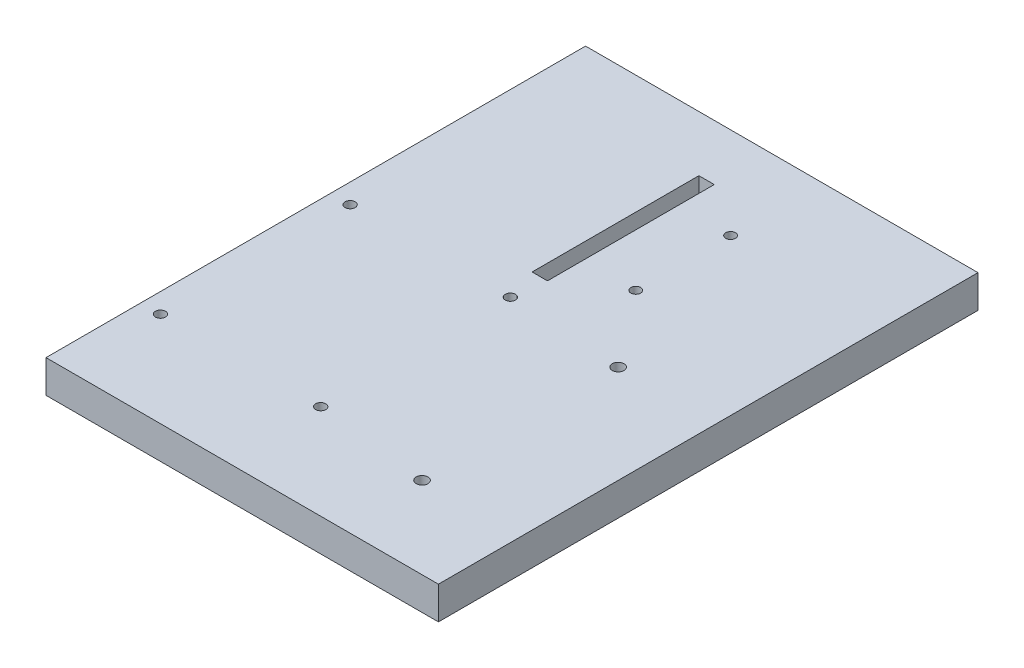
ISO-10303-21;
HEADER;
FILE_DESCRIPTION(('STEP AP214'),'2;1');
FILE_NAME('part.step','',(''),(''),'','','');
FILE_SCHEMA(('AUTOMOTIVE_DESIGN { 1 0 10303 214 1 1 1 1 }'));
ENDSEC;
DATA;
#1=APPLICATION_CONTEXT('core data for automotive mechanical design processes');
#2=APPLICATION_PROTOCOL_DEFINITION('international standard','automotive_design',2000,#1);
#3=PRODUCT_CONTEXT('',#1,'mechanical');
#4=PRODUCT('Part','Part','',(#3));
#5=PRODUCT_RELATED_PRODUCT_CATEGORY('part','',(#4));
#6=PRODUCT_DEFINITION_FORMATION('','',#4);
#7=PRODUCT_DEFINITION_CONTEXT('part definition',#1,'design');
#8=PRODUCT_DEFINITION('design','',#6,#7);
#9=PRODUCT_DEFINITION_SHAPE('','',#8);
#10=(LENGTH_UNIT() NAMED_UNIT(*) SI_UNIT(.MILLI.,.METRE.));
#11=(NAMED_UNIT(*) PLANE_ANGLE_UNIT() SI_UNIT($,.RADIAN.));
#12=(NAMED_UNIT(*) SI_UNIT($,.STERADIAN.) SOLID_ANGLE_UNIT());
#13=UNCERTAINTY_MEASURE_WITH_UNIT(LENGTH_MEASURE(1.E-05),#10,'distance_accuracy_value','');
#14=(GEOMETRIC_REPRESENTATION_CONTEXT(3) GLOBAL_UNCERTAINTY_ASSIGNED_CONTEXT((#13)) GLOBAL_UNIT_ASSIGNED_CONTEXT((#10,
#11,#12)) REPRESENTATION_CONTEXT('',''));
#15=CARTESIAN_POINT('',(0.,0.,0.));
#16=DIRECTION('',(0.,0.,1.));
#17=DIRECTION('',(1.,0.,0.));
#18=AXIS2_PLACEMENT_3D('',#15,#16,#17);
#19=CARTESIAN_POINT('',(0.,10.,0.));
#20=DIRECTION('',(1.,0.,0.));
#21=DIRECTION('',(0.,0.,-1.));
#22=AXIS2_PLACEMENT_3D('',#19,#20,#21);
#23=PLANE('',#22);
#24=DIRECTION('',(0.,0.,1.));
#25=VECTOR('',#24,1.);
#26=CARTESIAN_POINT('',(0.,0.,0.));
#27=LINE('',#26,#25);
#28=CARTESIAN_POINT('',(0.,0.,-165.));
#29=VERTEX_POINT('',#28);
#30=CARTESIAN_POINT('',(0.,0.,0.));
#31=VERTEX_POINT('',#30);
#32=EDGE_CURVE('E224',#29,#31,#27,.T.);
#33=ORIENTED_EDGE('',*,*,#32,.T.);
#34=DIRECTION('',(0.,-1.,0.));
#35=VECTOR('',#34,1.);
#36=CARTESIAN_POINT('',(0.,10.,0.));
#37=LINE('',#36,#35);
#38=CARTESIAN_POINT('',(0.,10.,0.));
#39=VERTEX_POINT('',#38);
#40=EDGE_CURVE('E11',#39,#31,#37,.T.);
#41=ORIENTED_EDGE('',*,*,#40,.F.);
#42=DIRECTION('',(0.,0.,1.));
#43=VECTOR('',#42,1.);
#44=CARTESIAN_POINT('',(0.,10.,0.));
#45=LINE('',#44,#43);
#46=CARTESIAN_POINT('',(0.,10.,-165.));
#47=VERTEX_POINT('',#46);
#48=EDGE_CURVE('E225',#47,#39,#45,.T.);
#49=ORIENTED_EDGE('',*,*,#48,.F.);
#50=DIRECTION('',(0.,-1.,0.));
#51=VECTOR('',#50,1.);
#52=CARTESIAN_POINT('',(0.,10.,-165.));
#53=LINE('',#52,#51);
#54=EDGE_CURVE('E235',#47,#29,#53,.T.);
#55=ORIENTED_EDGE('',*,*,#54,.T.);
#56=EDGE_LOOP('',(#33,#41,#49,#55));
#57=FACE_BOUND('',#56,.T.);
#58=ADVANCED_FACE('F33',(#57),#23,.F.);
#59=CARTESIAN_POINT('',(0.,10.,0.));
#60=DIRECTION('',(0.,0.,-1.));
#61=DIRECTION('',(-1.,0.,0.));
#62=AXIS2_PLACEMENT_3D('',#59,#60,#61);
#63=PLANE('',#62);
#64=DIRECTION('',(1.,0.,0.));
#65=VECTOR('',#64,1.);
#66=CARTESIAN_POINT('',(0.,0.,0.));
#67=LINE('',#66,#65);
#68=CARTESIAN_POINT('',(120.,0.,0.));
#69=VERTEX_POINT('',#68);
#70=EDGE_CURVE('E238',#31,#69,#67,.T.);
#71=ORIENTED_EDGE('',*,*,#70,.T.);
#72=DIRECTION('',(0.,-1.,0.));
#73=VECTOR('',#72,1.);
#74=CARTESIAN_POINT('',(120.,10.,0.));
#75=LINE('',#74,#73);
#76=CARTESIAN_POINT('',(120.,10.,0.));
#77=VERTEX_POINT('',#76);
#78=EDGE_CURVE('E40',#77,#69,#75,.T.);
#79=ORIENTED_EDGE('',*,*,#78,.F.);
#80=DIRECTION('',(1.,0.,0.));
#81=VECTOR('',#80,1.);
#82=CARTESIAN_POINT('',(0.,10.,0.));
#83=LINE('',#82,#81);
#84=EDGE_CURVE('E228',#39,#77,#83,.T.);
#85=ORIENTED_EDGE('',*,*,#84,.F.);
#86=ORIENTED_EDGE('',*,*,#40,.T.);
#87=EDGE_LOOP('',(#71,#79,#85,#86));
#88=FACE_BOUND('',#87,.T.);
#89=ADVANCED_FACE('F267',(#88),#63,.F.);
#90=CARTESIAN_POINT('',(120.,10.,0.));
#91=DIRECTION('',(-1.,0.,0.));
#92=DIRECTION('',(0.,0.,1.));
#93=AXIS2_PLACEMENT_3D('',#90,#91,#92);
#94=PLANE('',#93);
#95=DIRECTION('',(0.,0.,-1.));
#96=VECTOR('',#95,1.);
#97=CARTESIAN_POINT('',(120.,0.,0.));
#98=LINE('',#97,#96);
#99=CARTESIAN_POINT('',(120.,0.,-165.));
#100=VERTEX_POINT('',#99);
#101=EDGE_CURVE('E240',#69,#100,#98,.T.);
#102=ORIENTED_EDGE('',*,*,#101,.T.);
#103=DIRECTION('',(0.,-1.,0.));
#104=VECTOR('',#103,1.);
#105=CARTESIAN_POINT('',(120.,10.,-165.));
#106=LINE('',#105,#104);
#107=CARTESIAN_POINT('',(120.,10.,-165.));
#108=VERTEX_POINT('',#107);
#109=EDGE_CURVE('E245',#108,#100,#106,.T.);
#110=ORIENTED_EDGE('',*,*,#109,.F.);
#111=DIRECTION('',(0.,0.,-1.));
#112=VECTOR('',#111,1.);
#113=CARTESIAN_POINT('',(120.,10.,0.));
#114=LINE('',#113,#112);
#115=EDGE_CURVE('E231',#77,#108,#114,.T.);
#116=ORIENTED_EDGE('',*,*,#115,.F.);
#117=ORIENTED_EDGE('',*,*,#78,.T.);
#118=EDGE_LOOP('',(#102,#110,#116,#117));
#119=FACE_BOUND('',#118,.T.);
#120=ADVANCED_FACE('F252',(#119),#94,.F.);
#121=CARTESIAN_POINT('',(0.,10.,-165.));
#122=DIRECTION('',(0.,0.,1.));
#123=DIRECTION('',(1.,0.,0.));
#124=AXIS2_PLACEMENT_3D('',#121,#122,#123);
#125=PLANE('',#124);
#126=DIRECTION('',(-1.,0.,0.));
#127=VECTOR('',#126,1.);
#128=CARTESIAN_POINT('',(0.,0.,-165.));
#129=LINE('',#128,#127);
#130=EDGE_CURVE('E229',#100,#29,#129,.T.);
#131=ORIENTED_EDGE('',*,*,#130,.T.);
#132=ORIENTED_EDGE('',*,*,#54,.F.);
#133=DIRECTION('',(-1.,0.,0.));
#134=VECTOR('',#133,1.);
#135=CARTESIAN_POINT('',(0.,10.,-165.));
#136=LINE('',#135,#134);
#137=EDGE_CURVE('E233',#108,#47,#136,.T.);
#138=ORIENTED_EDGE('',*,*,#137,.F.);
#139=ORIENTED_EDGE('',*,*,#109,.T.);
#140=EDGE_LOOP('',(#131,#132,#138,#139));
#141=FACE_BOUND('',#140,.T.);
#142=ADVANCED_FACE('F260',(#141),#125,.F.);
#143=CARTESIAN_POINT('',(0.,10.,0.));
#144=DIRECTION('',(0.,-1.,0.));
#145=DIRECTION('',(0.,0.,-1.));
#146=AXIS2_PLACEMENT_3D('',#143,#144,#145);
#147=PLANE('',#146);
#148=CARTESIAN_POINT('',(72.35,10.,-137.));
#149=DIRECTION('',(0.,1.,0.));
#150=DIRECTION('',(0.,0.,1.));
#151=AXIS2_PLACEMENT_3D('',#148,#149,#150);
#152=CIRCLE('',#151,1.5);
#153=CARTESIAN_POINT('',(72.35,10.,-135.5));
#154=VERTEX_POINT('',#153);
#155=EDGE_CURVE('E401',#154,#154,#152,.T.);
#156=ORIENTED_EDGE('',*,*,#155,.F.);
#157=EDGE_LOOP('',(#156));
#158=FACE_BOUND('',#157,.T.);
#159=CARTESIAN_POINT('',(72.35,10.,-108.));
#160=DIRECTION('',(0.,1.,0.));
#161=DIRECTION('',(0.,0.,1.));
#162=AXIS2_PLACEMENT_3D('',#159,#160,#161);
#163=CIRCLE('',#162,1.5);
#164=CARTESIAN_POINT('',(72.35,10.,-106.5));
#165=VERTEX_POINT('',#164);
#166=EDGE_CURVE('E409',#165,#165,#163,.T.);
#167=ORIENTED_EDGE('',*,*,#166,.F.);
#168=EDGE_LOOP('',(#167));
#169=FACE_BOUND('',#168,.T.);
#170=DIRECTION('',(0.,0.,-1.));
#171=VECTOR('',#170,1.);
#172=CARTESIAN_POINT('',(56.35,10.,-148.));
#173=LINE('',#172,#171);
#174=CARTESIAN_POINT('',(56.35,10.,-97.));
#175=VERTEX_POINT('',#174);
#176=CARTESIAN_POINT('',(56.35,10.,-148.));
#177=VERTEX_POINT('',#176);
#178=EDGE_CURVE('E121',#175,#177,#173,.T.);
#179=ORIENTED_EDGE('',*,*,#178,.F.);
#180=DIRECTION('',(1.,0.,0.));
#181=VECTOR('',#180,1.);
#182=CARTESIAN_POINT('',(51.65,10.,-97.));
#183=LINE('',#182,#181);
#184=CARTESIAN_POINT('',(51.65,10.,-97.));
#185=VERTEX_POINT('',#184);
#186=EDGE_CURVE('E114',#185,#175,#183,.T.);
#187=ORIENTED_EDGE('',*,*,#186,.F.);
#188=DIRECTION('',(0.,0.,1.));
#189=VECTOR('',#188,1.);
#190=CARTESIAN_POINT('',(51.65,10.,-148.));
#191=LINE('',#190,#189);
#192=CARTESIAN_POINT('',(51.65,10.,-148.));
#193=VERTEX_POINT('',#192);
#194=EDGE_CURVE('E125',#193,#185,#191,.T.);
#195=ORIENTED_EDGE('',*,*,#194,.F.);
#196=DIRECTION('',(-1.,0.,0.));
#197=VECTOR('',#196,1.);
#198=CARTESIAN_POINT('',(51.65,10.,-148.));
#199=LINE('',#198,#197);
#200=EDGE_CURVE('E47',#177,#193,#199,.T.);
#201=ORIENTED_EDGE('',*,*,#200,.F.);
#202=EDGE_LOOP('',(#179,#187,#195,#201));
#203=FACE_BOUND('',#202,.T.);
#204=CARTESIAN_POINT('',(90.,10.,-25.));
#205=DIRECTION('',(0.,-1.,0.));
#206=DIRECTION('',(0.,0.,-1.));
#207=AXIS2_PLACEMENT_3D('',#204,#205,#206);
#208=CIRCLE('',#207,1.8);
#209=CARTESIAN_POINT('',(90.,10.,-26.8));
#210=VERTEX_POINT('',#209);
#211=EDGE_CURVE('E146',#210,#210,#208,.T.);
#212=ORIENTED_EDGE('',*,*,#211,.T.);
#213=EDGE_LOOP('',(#212));
#214=FACE_BOUND('',#213,.T.);
#215=CARTESIAN_POINT('',(90.,10.,-84.95));
#216=DIRECTION('',(0.,-1.,0.));
#217=DIRECTION('',(0.,0.,-1.));
#218=AXIS2_PLACEMENT_3D('',#215,#216,#217);
#219=CIRCLE('',#218,1.8);
#220=CARTESIAN_POINT('',(90.,10.,-86.75));
#221=VERTEX_POINT('',#220);
#222=EDGE_CURVE('E161',#221,#221,#219,.T.);
#223=ORIENTED_EDGE('',*,*,#222,.T.);
#224=EDGE_LOOP('',(#223));
#225=FACE_BOUND('',#224,.T.);
#226=CARTESIAN_POINT('',(6.,10.,-29.));
#227=DIRECTION('',(0.,-1.,0.));
#228=DIRECTION('',(0.,0.,-1.));
#229=AXIS2_PLACEMENT_3D('',#226,#227,#228);
#230=CIRCLE('',#229,1.55);
#231=CARTESIAN_POINT('',(6.,10.,-30.55));
#232=VERTEX_POINT('',#231);
#233=EDGE_CURVE('E176',#232,#232,#230,.T.);
#234=ORIENTED_EDGE('',*,*,#233,.T.);
#235=EDGE_LOOP('',(#234));
#236=FACE_BOUND('',#235,.T.);
#237=CARTESIAN_POINT('',(55.,10.,-29.));
#238=DIRECTION('',(0.,-1.,0.));
#239=DIRECTION('',(0.,0.,-1.));
#240=AXIS2_PLACEMENT_3D('',#237,#238,#239);
#241=CIRCLE('',#240,1.55);
#242=CARTESIAN_POINT('',(55.,10.,-30.55));
#243=VERTEX_POINT('',#242);
#244=EDGE_CURVE('E191',#243,#243,#241,.T.);
#245=ORIENTED_EDGE('',*,*,#244,.T.);
#246=EDGE_LOOP('',(#245));
#247=FACE_BOUND('',#246,.T.);
#248=CARTESIAN_POINT('',(55.,10.,-87.));
#249=DIRECTION('',(0.,-1.,0.));
#250=DIRECTION('',(0.,0.,-1.));
#251=AXIS2_PLACEMENT_3D('',#248,#249,#250);
#252=CIRCLE('',#251,1.55);
#253=CARTESIAN_POINT('',(55.,10.,-88.55));
#254=VERTEX_POINT('',#253);
#255=EDGE_CURVE('E206',#254,#254,#252,.T.);
#256=ORIENTED_EDGE('',*,*,#255,.T.);
#257=EDGE_LOOP('',(#256));
#258=FACE_BOUND('',#257,.T.);
#259=CARTESIAN_POINT('',(5.99999999999999,10.,-87.));
#260=DIRECTION('',(0.,-1.,0.));
#261=DIRECTION('',(0.,0.,-1.));
#262=AXIS2_PLACEMENT_3D('',#259,#260,#261);
#263=CIRCLE('',#262,1.55);
#264=CARTESIAN_POINT('',(5.99999999999999,10.,-88.55));
#265=VERTEX_POINT('',#264);
#266=EDGE_CURVE('E221',#265,#265,#263,.T.);
#267=ORIENTED_EDGE('',*,*,#266,.T.);
#268=EDGE_LOOP('',(#267));
#269=FACE_BOUND('',#268,.T.);
#270=ORIENTED_EDGE('',*,*,#48,.T.);
#271=ORIENTED_EDGE('',*,*,#84,.T.);
#272=ORIENTED_EDGE('',*,*,#115,.T.);
#273=ORIENTED_EDGE('',*,*,#137,.T.);
#274=EDGE_LOOP('',(#270,#271,#272,#273));
#275=FACE_BOUND('',#274,.T.);
#276=ADVANCED_FACE('F266',(#158,#169,#203,#214,#225,#236,#247,#258,#269,#275),#147,.F.);
#277=CARTESIAN_POINT('',(0.,0.,0.));
#278=DIRECTION('',(0.,-1.,0.));
#279=DIRECTION('',(0.,0.,-1.));
#280=AXIS2_PLACEMENT_3D('',#277,#278,#279);
#281=PLANE('',#280);
#282=CARTESIAN_POINT('',(72.35,0.,-137.));
#283=DIRECTION('',(0.,-1.,0.));
#284=DIRECTION('',(0.,0.,-1.));
#285=AXIS2_PLACEMENT_3D('',#282,#283,#284);
#286=CIRCLE('',#285,1.5);
#287=CARTESIAN_POINT('',(72.35,0.,-138.5));
#288=VERTEX_POINT('',#287);
#289=EDGE_CURVE('E404',#288,#288,#286,.F.);
#290=ORIENTED_EDGE('',*,*,#289,.T.);
#291=EDGE_LOOP('',(#290));
#292=FACE_BOUND('',#291,.T.);
#293=CARTESIAN_POINT('',(72.35,0.,-108.));
#294=DIRECTION('',(0.,-1.,0.));
#295=DIRECTION('',(0.,0.,-1.));
#296=AXIS2_PLACEMENT_3D('',#293,#294,#295);
#297=CIRCLE('',#296,1.5);
#298=CARTESIAN_POINT('',(72.35,0.,-109.5));
#299=VERTEX_POINT('',#298);
#300=EDGE_CURVE('E406',#299,#299,#297,.F.);
#301=ORIENTED_EDGE('',*,*,#300,.T.);
#302=EDGE_LOOP('',(#301));
#303=FACE_BOUND('',#302,.T.);
#304=DIRECTION('',(1.,0.,0.));
#305=VECTOR('',#304,1.);
#306=CARTESIAN_POINT('',(51.65,0.,-97.));
#307=LINE('',#306,#305);
#308=CARTESIAN_POINT('',(51.65,0.,-97.));
#309=VERTEX_POINT('',#308);
#310=CARTESIAN_POINT('',(56.35,0.,-97.));
#311=VERTEX_POINT('',#310);
#312=EDGE_CURVE('E111',#309,#311,#307,.T.);
#313=ORIENTED_EDGE('',*,*,#312,.T.);
#314=DIRECTION('',(0.,0.,-1.));
#315=VECTOR('',#314,1.);
#316=CARTESIAN_POINT('',(56.35,0.,-148.));
#317=LINE('',#316,#315);
#318=CARTESIAN_POINT('',(56.35,0.,-148.));
#319=VERTEX_POINT('',#318);
#320=EDGE_CURVE('E98',#311,#319,#317,.T.);
#321=ORIENTED_EDGE('',*,*,#320,.T.);
#322=DIRECTION('',(-1.,0.,0.));
#323=VECTOR('',#322,1.);
#324=CARTESIAN_POINT('',(51.65,0.,-148.));
#325=LINE('',#324,#323);
#326=CARTESIAN_POINT('',(51.65,0.,-148.));
#327=VERTEX_POINT('',#326);
#328=EDGE_CURVE('E129',#319,#327,#325,.T.);
#329=ORIENTED_EDGE('',*,*,#328,.T.);
#330=DIRECTION('',(0.,0.,1.));
#331=VECTOR('',#330,1.);
#332=CARTESIAN_POINT('',(51.65,0.,-148.));
#333=LINE('',#332,#331);
#334=EDGE_CURVE('E119',#327,#309,#333,.T.);
#335=ORIENTED_EDGE('',*,*,#334,.T.);
#336=EDGE_LOOP('',(#313,#321,#329,#335));
#337=FACE_BOUND('',#336,.T.);
#338=CARTESIAN_POINT('',(90.,0.,-25.));
#339=DIRECTION('',(0.,-1.,0.));
#340=DIRECTION('',(0.,0.,-1.));
#341=AXIS2_PLACEMENT_3D('',#338,#339,#340);
#342=CIRCLE('',#341,3.525);
#343=CARTESIAN_POINT('',(90.,0.,-28.525));
#344=VERTEX_POINT('',#343);
#345=EDGE_CURVE('E134',#344,#344,#342,.T.);
#346=ORIENTED_EDGE('',*,*,#345,.F.);
#347=EDGE_LOOP('',(#346));
#348=FACE_BOUND('',#347,.T.);
#349=CARTESIAN_POINT('',(90.,0.,-84.95));
#350=DIRECTION('',(0.,-1.,0.));
#351=DIRECTION('',(0.,0.,-1.));
#352=AXIS2_PLACEMENT_3D('',#349,#350,#351);
#353=CIRCLE('',#352,3.525);
#354=CARTESIAN_POINT('',(90.,0.,-88.475));
#355=VERTEX_POINT('',#354);
#356=EDGE_CURVE('E149',#355,#355,#353,.T.);
#357=ORIENTED_EDGE('',*,*,#356,.F.);
#358=EDGE_LOOP('',(#357));
#359=FACE_BOUND('',#358,.T.);
#360=CARTESIAN_POINT('',(6.,0.,-29.));
#361=DIRECTION('',(0.,-1.,0.));
#362=DIRECTION('',(0.,0.,-1.));
#363=AXIS2_PLACEMENT_3D('',#360,#361,#362);
#364=CIRCLE('',#363,3.025);
#365=CARTESIAN_POINT('',(6.,0.,-32.025));
#366=VERTEX_POINT('',#365);
#367=EDGE_CURVE('E164',#366,#366,#364,.T.);
#368=ORIENTED_EDGE('',*,*,#367,.F.);
#369=EDGE_LOOP('',(#368));
#370=FACE_BOUND('',#369,.T.);
#371=CARTESIAN_POINT('',(55.,0.,-29.));
#372=DIRECTION('',(0.,-1.,0.));
#373=DIRECTION('',(0.,0.,-1.));
#374=AXIS2_PLACEMENT_3D('',#371,#372,#373);
#375=CIRCLE('',#374,3.025);
#376=CARTESIAN_POINT('',(55.,0.,-32.025));
#377=VERTEX_POINT('',#376);
#378=EDGE_CURVE('E179',#377,#377,#375,.T.);
#379=ORIENTED_EDGE('',*,*,#378,.F.);
#380=EDGE_LOOP('',(#379));
#381=FACE_BOUND('',#380,.T.);
#382=CARTESIAN_POINT('',(55.,0.,-87.));
#383=DIRECTION('',(0.,-1.,0.));
#384=DIRECTION('',(0.,0.,-1.));
#385=AXIS2_PLACEMENT_3D('',#382,#383,#384);
#386=CIRCLE('',#385,3.025);
#387=CARTESIAN_POINT('',(55.,0.,-90.025));
#388=VERTEX_POINT('',#387);
#389=EDGE_CURVE('E194',#388,#388,#386,.T.);
#390=ORIENTED_EDGE('',*,*,#389,.F.);
#391=EDGE_LOOP('',(#390));
#392=FACE_BOUND('',#391,.T.);
#393=CARTESIAN_POINT('',(5.99999999999999,0.,-87.));
#394=DIRECTION('',(0.,-1.,0.));
#395=DIRECTION('',(0.,0.,-1.));
#396=AXIS2_PLACEMENT_3D('',#393,#394,#395);
#397=CIRCLE('',#396,3.025);
#398=CARTESIAN_POINT('',(5.99999999999999,0.,-90.025));
#399=VERTEX_POINT('',#398);
#400=EDGE_CURVE('E209',#399,#399,#397,.T.);
#401=ORIENTED_EDGE('',*,*,#400,.F.);
#402=EDGE_LOOP('',(#401));
#403=FACE_BOUND('',#402,.T.);
#404=ORIENTED_EDGE('',*,*,#32,.F.);
#405=ORIENTED_EDGE('',*,*,#130,.F.);
#406=ORIENTED_EDGE('',*,*,#101,.F.);
#407=ORIENTED_EDGE('',*,*,#70,.F.);
#408=EDGE_LOOP('',(#404,#405,#406,#407));
#409=FACE_BOUND('',#408,.T.);
#410=ADVANCED_FACE('F117',(#292,#303,#337,#348,#359,#370,#381,#392,#403,#409),#281,.T.);
#411=CARTESIAN_POINT('',(5.99999999999999,0.,-87.));
#412=DIRECTION('',(0.,-1.,0.));
#413=DIRECTION('',(0.,0.,-1.));
#414=AXIS2_PLACEMENT_3D('',#411,#412,#413);
#415=CYLINDRICAL_SURFACE('',#414,1.55);
#416=ORIENTED_EDGE('',*,*,#266,.F.);
#417=EDGE_LOOP('',(#416));
#418=FACE_BOUND('',#417,.T.);
#419=CARTESIAN_POINT('',(5.99999999999999,2.1,-87.));
#420=DIRECTION('',(0.,-1.,0.));
#421=DIRECTION('',(0.,0.,-1.));
#422=AXIS2_PLACEMENT_3D('',#419,#420,#421);
#423=CIRCLE('',#422,1.55);
#424=CARTESIAN_POINT('',(5.99999999999999,2.1,-88.55));
#425=VERTEX_POINT('',#424);
#426=EDGE_CURVE('E218',#425,#425,#423,.T.);
#427=ORIENTED_EDGE('',*,*,#426,.T.);
#428=EDGE_LOOP('',(#427));
#429=FACE_BOUND('',#428,.T.);
#430=ADVANCED_FACE('F279',(#418,#429),#415,.F.);
#431=CARTESIAN_POINT('',(8.99999999999999,2.1,-87.));
#432=DIRECTION('',(0.,1.,0.));
#433=DIRECTION('',(0.,0.,1.));
#434=AXIS2_PLACEMENT_3D('',#431,#432,#433);
#435=PLANE('',#434);
#436=ORIENTED_EDGE('',*,*,#426,.F.);
#437=EDGE_LOOP('',(#436));
#438=FACE_BOUND('',#437,.T.);
#439=CARTESIAN_POINT('',(5.99999999999999,2.1,-87.));
#440=DIRECTION('',(0.,-1.,0.));
#441=DIRECTION('',(0.,0.,-1.));
#442=AXIS2_PLACEMENT_3D('',#439,#440,#441);
#443=CIRCLE('',#442,3.);
#444=CARTESIAN_POINT('',(5.99999999999999,2.1,-90.));
#445=VERTEX_POINT('',#444);
#446=EDGE_CURVE('E215',#445,#445,#443,.T.);
#447=ORIENTED_EDGE('',*,*,#446,.T.);
#448=EDGE_LOOP('',(#447));
#449=FACE_BOUND('',#448,.T.);
#450=ADVANCED_FACE('F286',(#438,#449),#435,.F.);
#451=CARTESIAN_POINT('',(5.99999999999999,0.,-87.));
#452=DIRECTION('',(0.,-1.,0.));
#453=DIRECTION('',(0.,0.,-1.));
#454=AXIS2_PLACEMENT_3D('',#451,#452,#453);
#455=CYLINDRICAL_SURFACE('',#454,3.);
#456=ORIENTED_EDGE('',*,*,#446,.F.);
#457=EDGE_LOOP('',(#456));
#458=FACE_BOUND('',#457,.T.);
#459=CARTESIAN_POINT('',(5.99999999999999,0.0250000000000005,-87.));
#460=DIRECTION('',(0.,-1.,0.));
#461=DIRECTION('',(0.,0.,-1.));
#462=AXIS2_PLACEMENT_3D('',#459,#460,#461);
#463=CIRCLE('',#462,3.);
#464=CARTESIAN_POINT('',(5.99999999999999,0.0250000000000005,-90.));
#465=VERTEX_POINT('',#464);
#466=EDGE_CURVE('E212',#465,#465,#463,.T.);
#467=ORIENTED_EDGE('',*,*,#466,.T.);
#468=EDGE_LOOP('',(#467));
#469=FACE_BOUND('',#468,.T.);
#470=ADVANCED_FACE('F290',(#458,#469),#455,.F.);
#471=CARTESIAN_POINT('',(5.99999999999999,0.,-87.));
#472=DIRECTION('',(0.,-1.,0.));
#473=DIRECTION('',(0.,0.,-1.));
#474=AXIS2_PLACEMENT_3D('',#471,#472,#473);
#475=CONICAL_SURFACE('',#474,3.025,0.785398163397453);
#476=ORIENTED_EDGE('',*,*,#466,.F.);
#477=EDGE_LOOP('',(#476));
#478=FACE_BOUND('',#477,.T.);
#479=ORIENTED_EDGE('',*,*,#400,.T.);
#480=EDGE_LOOP('',(#479));
#481=FACE_BOUND('',#480,.T.);
#482=ADVANCED_FACE('F294',(#478,#481),#475,.F.);
#483=CARTESIAN_POINT('',(55.,0.,-87.));
#484=DIRECTION('',(0.,-1.,0.));
#485=DIRECTION('',(0.,0.,-1.));
#486=AXIS2_PLACEMENT_3D('',#483,#484,#485);
#487=CYLINDRICAL_SURFACE('',#486,1.55);
#488=ORIENTED_EDGE('',*,*,#255,.F.);
#489=EDGE_LOOP('',(#488));
#490=FACE_BOUND('',#489,.T.);
#491=CARTESIAN_POINT('',(55.,2.1,-87.));
#492=DIRECTION('',(0.,-1.,0.));
#493=DIRECTION('',(0.,0.,-1.));
#494=AXIS2_PLACEMENT_3D('',#491,#492,#493);
#495=CIRCLE('',#494,1.55);
#496=CARTESIAN_POINT('',(55.,2.1,-88.55));
#497=VERTEX_POINT('',#496);
#498=EDGE_CURVE('E203',#497,#497,#495,.T.);
#499=ORIENTED_EDGE('',*,*,#498,.T.);
#500=EDGE_LOOP('',(#499));
#501=FACE_BOUND('',#500,.T.);
#502=ADVANCED_FACE('F298',(#490,#501),#487,.F.);
#503=CARTESIAN_POINT('',(58.,2.1,-87.));
#504=DIRECTION('',(0.,1.,0.));
#505=DIRECTION('',(0.,0.,1.));
#506=AXIS2_PLACEMENT_3D('',#503,#504,#505);
#507=PLANE('',#506);
#508=ORIENTED_EDGE('',*,*,#498,.F.);
#509=EDGE_LOOP('',(#508));
#510=FACE_BOUND('',#509,.T.);
#511=CARTESIAN_POINT('',(55.,2.1,-87.));
#512=DIRECTION('',(0.,-1.,0.));
#513=DIRECTION('',(0.,0.,-1.));
#514=AXIS2_PLACEMENT_3D('',#511,#512,#513);
#515=CIRCLE('',#514,3.);
#516=CARTESIAN_POINT('',(55.,2.1,-90.));
#517=VERTEX_POINT('',#516);
#518=EDGE_CURVE('E200',#517,#517,#515,.T.);
#519=ORIENTED_EDGE('',*,*,#518,.T.);
#520=EDGE_LOOP('',(#519));
#521=FACE_BOUND('',#520,.T.);
#522=ADVANCED_FACE('F302',(#510,#521),#507,.F.);
#523=CARTESIAN_POINT('',(55.,0.,-87.));
#524=DIRECTION('',(0.,-1.,0.));
#525=DIRECTION('',(0.,0.,-1.));
#526=AXIS2_PLACEMENT_3D('',#523,#524,#525);
#527=CYLINDRICAL_SURFACE('',#526,3.);
#528=ORIENTED_EDGE('',*,*,#518,.F.);
#529=EDGE_LOOP('',(#528));
#530=FACE_BOUND('',#529,.T.);
#531=CARTESIAN_POINT('',(55.,0.0250000000000005,-87.));
#532=DIRECTION('',(0.,-1.,0.));
#533=DIRECTION('',(0.,0.,-1.));
#534=AXIS2_PLACEMENT_3D('',#531,#532,#533);
#535=CIRCLE('',#534,3.);
#536=CARTESIAN_POINT('',(55.,0.0250000000000005,-90.));
#537=VERTEX_POINT('',#536);
#538=EDGE_CURVE('E197',#537,#537,#535,.T.);
#539=ORIENTED_EDGE('',*,*,#538,.T.);
#540=EDGE_LOOP('',(#539));
#541=FACE_BOUND('',#540,.T.);
#542=ADVANCED_FACE('F306',(#530,#541),#527,.F.);
#543=CARTESIAN_POINT('',(55.,0.,-87.));
#544=DIRECTION('',(0.,-1.,0.));
#545=DIRECTION('',(0.,0.,-1.));
#546=AXIS2_PLACEMENT_3D('',#543,#544,#545);
#547=CONICAL_SURFACE('',#546,3.025,0.785398163397383);
#548=ORIENTED_EDGE('',*,*,#538,.F.);
#549=EDGE_LOOP('',(#548));
#550=FACE_BOUND('',#549,.T.);
#551=ORIENTED_EDGE('',*,*,#389,.T.);
#552=EDGE_LOOP('',(#551));
#553=FACE_BOUND('',#552,.T.);
#554=ADVANCED_FACE('F310',(#550,#553),#547,.F.);
#555=CARTESIAN_POINT('',(55.,0.,-29.));
#556=DIRECTION('',(0.,-1.,0.));
#557=DIRECTION('',(0.,0.,-1.));
#558=AXIS2_PLACEMENT_3D('',#555,#556,#557);
#559=CYLINDRICAL_SURFACE('',#558,1.55);
#560=ORIENTED_EDGE('',*,*,#244,.F.);
#561=EDGE_LOOP('',(#560));
#562=FACE_BOUND('',#561,.T.);
#563=CARTESIAN_POINT('',(55.,2.1,-29.));
#564=DIRECTION('',(0.,-1.,0.));
#565=DIRECTION('',(0.,0.,-1.));
#566=AXIS2_PLACEMENT_3D('',#563,#564,#565);
#567=CIRCLE('',#566,1.55);
#568=CARTESIAN_POINT('',(55.,2.1,-30.55));
#569=VERTEX_POINT('',#568);
#570=EDGE_CURVE('E188',#569,#569,#567,.T.);
#571=ORIENTED_EDGE('',*,*,#570,.T.);
#572=EDGE_LOOP('',(#571));
#573=FACE_BOUND('',#572,.T.);
#574=ADVANCED_FACE('F314',(#562,#573),#559,.F.);
#575=CARTESIAN_POINT('',(58.,2.1,-29.));
#576=DIRECTION('',(0.,1.,0.));
#577=DIRECTION('',(0.,0.,1.));
#578=AXIS2_PLACEMENT_3D('',#575,#576,#577);
#579=PLANE('',#578);
#580=ORIENTED_EDGE('',*,*,#570,.F.);
#581=EDGE_LOOP('',(#580));
#582=FACE_BOUND('',#581,.T.);
#583=CARTESIAN_POINT('',(55.,2.1,-29.));
#584=DIRECTION('',(0.,-1.,0.));
#585=DIRECTION('',(0.,0.,-1.));
#586=AXIS2_PLACEMENT_3D('',#583,#584,#585);
#587=CIRCLE('',#586,3.);
#588=CARTESIAN_POINT('',(55.,2.1,-32.));
#589=VERTEX_POINT('',#588);
#590=EDGE_CURVE('E185',#589,#589,#587,.T.);
#591=ORIENTED_EDGE('',*,*,#590,.T.);
#592=EDGE_LOOP('',(#591));
#593=FACE_BOUND('',#592,.T.);
#594=ADVANCED_FACE('F318',(#582,#593),#579,.F.);
#595=CARTESIAN_POINT('',(55.,0.,-29.));
#596=DIRECTION('',(0.,-1.,0.));
#597=DIRECTION('',(0.,0.,-1.));
#598=AXIS2_PLACEMENT_3D('',#595,#596,#597);
#599=CYLINDRICAL_SURFACE('',#598,3.);
#600=ORIENTED_EDGE('',*,*,#590,.F.);
#601=EDGE_LOOP('',(#600));
#602=FACE_BOUND('',#601,.T.);
#603=CARTESIAN_POINT('',(55.,0.0250000000000005,-29.));
#604=DIRECTION('',(0.,-1.,0.));
#605=DIRECTION('',(0.,0.,-1.));
#606=AXIS2_PLACEMENT_3D('',#603,#604,#605);
#607=CIRCLE('',#606,3.);
#608=CARTESIAN_POINT('',(55.,0.0250000000000005,-32.));
#609=VERTEX_POINT('',#608);
#610=EDGE_CURVE('E182',#609,#609,#607,.T.);
#611=ORIENTED_EDGE('',*,*,#610,.T.);
#612=EDGE_LOOP('',(#611));
#613=FACE_BOUND('',#612,.T.);
#614=ADVANCED_FACE('F322',(#602,#613),#599,.F.);
#615=CARTESIAN_POINT('',(55.,0.,-29.));
#616=DIRECTION('',(0.,-1.,0.));
#617=DIRECTION('',(0.,0.,-1.));
#618=AXIS2_PLACEMENT_3D('',#615,#616,#617);
#619=CONICAL_SURFACE('',#618,3.025,0.785398163397383);
#620=ORIENTED_EDGE('',*,*,#610,.F.);
#621=EDGE_LOOP('',(#620));
#622=FACE_BOUND('',#621,.T.);
#623=ORIENTED_EDGE('',*,*,#378,.T.);
#624=EDGE_LOOP('',(#623));
#625=FACE_BOUND('',#624,.T.);
#626=ADVANCED_FACE('F326',(#622,#625),#619,.F.);
#627=CARTESIAN_POINT('',(6.,0.,-29.));
#628=DIRECTION('',(0.,-1.,0.));
#629=DIRECTION('',(0.,0.,-1.));
#630=AXIS2_PLACEMENT_3D('',#627,#628,#629);
#631=CYLINDRICAL_SURFACE('',#630,1.55);
#632=ORIENTED_EDGE('',*,*,#233,.F.);
#633=EDGE_LOOP('',(#632));
#634=FACE_BOUND('',#633,.T.);
#635=CARTESIAN_POINT('',(6.,2.1,-29.));
#636=DIRECTION('',(0.,-1.,0.));
#637=DIRECTION('',(0.,0.,-1.));
#638=AXIS2_PLACEMENT_3D('',#635,#636,#637);
#639=CIRCLE('',#638,1.55);
#640=CARTESIAN_POINT('',(6.,2.1,-30.55));
#641=VERTEX_POINT('',#640);
#642=EDGE_CURVE('E173',#641,#641,#639,.T.);
#643=ORIENTED_EDGE('',*,*,#642,.T.);
#644=EDGE_LOOP('',(#643));
#645=FACE_BOUND('',#644,.T.);
#646=ADVANCED_FACE('F330',(#634,#645),#631,.F.);
#647=CARTESIAN_POINT('',(9.,2.1,-29.));
#648=DIRECTION('',(0.,1.,0.));
#649=DIRECTION('',(0.,0.,1.));
#650=AXIS2_PLACEMENT_3D('',#647,#648,#649);
#651=PLANE('',#650);
#652=ORIENTED_EDGE('',*,*,#642,.F.);
#653=EDGE_LOOP('',(#652));
#654=FACE_BOUND('',#653,.T.);
#655=CARTESIAN_POINT('',(6.,2.1,-29.));
#656=DIRECTION('',(0.,-1.,0.));
#657=DIRECTION('',(0.,0.,-1.));
#658=AXIS2_PLACEMENT_3D('',#655,#656,#657);
#659=CIRCLE('',#658,3.);
#660=CARTESIAN_POINT('',(6.,2.1,-32.));
#661=VERTEX_POINT('',#660);
#662=EDGE_CURVE('E170',#661,#661,#659,.T.);
#663=ORIENTED_EDGE('',*,*,#662,.T.);
#664=EDGE_LOOP('',(#663));
#665=FACE_BOUND('',#664,.T.);
#666=ADVANCED_FACE('F334',(#654,#665),#651,.F.);
#667=CARTESIAN_POINT('',(6.,0.,-29.));
#668=DIRECTION('',(0.,-1.,0.));
#669=DIRECTION('',(0.,0.,-1.));
#670=AXIS2_PLACEMENT_3D('',#667,#668,#669);
#671=CYLINDRICAL_SURFACE('',#670,3.);
#672=ORIENTED_EDGE('',*,*,#662,.F.);
#673=EDGE_LOOP('',(#672));
#674=FACE_BOUND('',#673,.T.);
#675=CARTESIAN_POINT('',(6.,0.0250000000000005,-29.));
#676=DIRECTION('',(0.,-1.,0.));
#677=DIRECTION('',(0.,0.,-1.));
#678=AXIS2_PLACEMENT_3D('',#675,#676,#677);
#679=CIRCLE('',#678,3.);
#680=CARTESIAN_POINT('',(6.,0.0250000000000005,-32.));
#681=VERTEX_POINT('',#680);
#682=EDGE_CURVE('E167',#681,#681,#679,.T.);
#683=ORIENTED_EDGE('',*,*,#682,.T.);
#684=EDGE_LOOP('',(#683));
#685=FACE_BOUND('',#684,.T.);
#686=ADVANCED_FACE('F338',(#674,#685),#671,.F.);
#687=CARTESIAN_POINT('',(6.,0.,-29.));
#688=DIRECTION('',(0.,-1.,0.));
#689=DIRECTION('',(0.,0.,-1.));
#690=AXIS2_PLACEMENT_3D('',#687,#688,#689);
#691=CONICAL_SURFACE('',#690,3.025,0.785398163397453);
#692=ORIENTED_EDGE('',*,*,#682,.F.);
#693=EDGE_LOOP('',(#692));
#694=FACE_BOUND('',#693,.T.);
#695=ORIENTED_EDGE('',*,*,#367,.T.);
#696=EDGE_LOOP('',(#695));
#697=FACE_BOUND('',#696,.T.);
#698=ADVANCED_FACE('F342',(#694,#697),#691,.F.);
#699=CARTESIAN_POINT('',(90.,0.,-84.95));
#700=DIRECTION('',(0.,-1.,0.));
#701=DIRECTION('',(0.,0.,-1.));
#702=AXIS2_PLACEMENT_3D('',#699,#700,#701);
#703=CYLINDRICAL_SURFACE('',#702,1.8);
#704=ORIENTED_EDGE('',*,*,#222,.F.);
#705=EDGE_LOOP('',(#704));
#706=FACE_BOUND('',#705,.T.);
#707=CARTESIAN_POINT('',(90.,2.4,-84.95));
#708=DIRECTION('',(0.,-1.,0.));
#709=DIRECTION('',(0.,0.,-1.));
#710=AXIS2_PLACEMENT_3D('',#707,#708,#709);
#711=CIRCLE('',#710,1.8);
#712=CARTESIAN_POINT('',(90.,2.4,-86.75));
#713=VERTEX_POINT('',#712);
#714=EDGE_CURVE('E158',#713,#713,#711,.T.);
#715=ORIENTED_EDGE('',*,*,#714,.T.);
#716=EDGE_LOOP('',(#715));
#717=FACE_BOUND('',#716,.T.);
#718=ADVANCED_FACE('F346',(#706,#717),#703,.F.);
#719=CARTESIAN_POINT('',(93.5,2.4,-84.95));
#720=DIRECTION('',(0.,1.,0.));
#721=DIRECTION('',(0.,0.,1.));
#722=AXIS2_PLACEMENT_3D('',#719,#720,#721);
#723=PLANE('',#722);
#724=ORIENTED_EDGE('',*,*,#714,.F.);
#725=EDGE_LOOP('',(#724));
#726=FACE_BOUND('',#725,.T.);
#727=CARTESIAN_POINT('',(90.,2.4,-84.95));
#728=DIRECTION('',(0.,-1.,0.));
#729=DIRECTION('',(0.,0.,-1.));
#730=AXIS2_PLACEMENT_3D('',#727,#728,#729);
#731=CIRCLE('',#730,3.5);
#732=CARTESIAN_POINT('',(90.,2.4,-88.45));
#733=VERTEX_POINT('',#732);
#734=EDGE_CURVE('E155',#733,#733,#731,.T.);
#735=ORIENTED_EDGE('',*,*,#734,.T.);
#736=EDGE_LOOP('',(#735));
#737=FACE_BOUND('',#736,.T.);
#738=ADVANCED_FACE('F350',(#726,#737),#723,.F.);
#739=CARTESIAN_POINT('',(90.,0.,-84.95));
#740=DIRECTION('',(0.,-1.,0.));
#741=DIRECTION('',(0.,0.,-1.));
#742=AXIS2_PLACEMENT_3D('',#739,#740,#741);
#743=CYLINDRICAL_SURFACE('',#742,3.5);
#744=ORIENTED_EDGE('',*,*,#734,.F.);
#745=EDGE_LOOP('',(#744));
#746=FACE_BOUND('',#745,.T.);
#747=CARTESIAN_POINT('',(90.,0.0249999999999998,-84.95));
#748=DIRECTION('',(0.,-1.,0.));
#749=DIRECTION('',(0.,0.,-1.));
#750=AXIS2_PLACEMENT_3D('',#747,#748,#749);
#751=CIRCLE('',#750,3.5);
#752=CARTESIAN_POINT('',(90.,0.0249999999999998,-88.45));
#753=VERTEX_POINT('',#752);
#754=EDGE_CURVE('E152',#753,#753,#751,.T.);
#755=ORIENTED_EDGE('',*,*,#754,.T.);
#756=EDGE_LOOP('',(#755));
#757=FACE_BOUND('',#756,.T.);
#758=ADVANCED_FACE('F354',(#746,#757),#743,.F.);
#759=CARTESIAN_POINT('',(90.,0.,-84.95));
#760=DIRECTION('',(0.,-1.,0.));
#761=DIRECTION('',(0.,0.,-1.));
#762=AXIS2_PLACEMENT_3D('',#759,#760,#761);
#763=CONICAL_SURFACE('',#762,3.525,0.785398163397396);
#764=ORIENTED_EDGE('',*,*,#754,.F.);
#765=EDGE_LOOP('',(#764));
#766=FACE_BOUND('',#765,.T.);
#767=ORIENTED_EDGE('',*,*,#356,.T.);
#768=EDGE_LOOP('',(#767));
#769=FACE_BOUND('',#768,.T.);
#770=ADVANCED_FACE('F358',(#766,#769),#763,.F.);
#771=CARTESIAN_POINT('',(90.,0.,-25.));
#772=DIRECTION('',(0.,-1.,0.));
#773=DIRECTION('',(0.,0.,-1.));
#774=AXIS2_PLACEMENT_3D('',#771,#772,#773);
#775=CYLINDRICAL_SURFACE('',#774,1.8);
#776=ORIENTED_EDGE('',*,*,#211,.F.);
#777=EDGE_LOOP('',(#776));
#778=FACE_BOUND('',#777,.T.);
#779=CARTESIAN_POINT('',(90.,2.4,-25.));
#780=DIRECTION('',(0.,-1.,0.));
#781=DIRECTION('',(0.,0.,-1.));
#782=AXIS2_PLACEMENT_3D('',#779,#780,#781);
#783=CIRCLE('',#782,1.8);
#784=CARTESIAN_POINT('',(90.,2.4,-26.8));
#785=VERTEX_POINT('',#784);
#786=EDGE_CURVE('E143',#785,#785,#783,.T.);
#787=ORIENTED_EDGE('',*,*,#786,.T.);
#788=EDGE_LOOP('',(#787));
#789=FACE_BOUND('',#788,.T.);
#790=ADVANCED_FACE('F362',(#778,#789),#775,.F.);
#791=CARTESIAN_POINT('',(93.5,2.4,-25.));
#792=DIRECTION('',(0.,1.,0.));
#793=DIRECTION('',(0.,0.,1.));
#794=AXIS2_PLACEMENT_3D('',#791,#792,#793);
#795=PLANE('',#794);
#796=ORIENTED_EDGE('',*,*,#786,.F.);
#797=EDGE_LOOP('',(#796));
#798=FACE_BOUND('',#797,.T.);
#799=CARTESIAN_POINT('',(90.,2.4,-25.));
#800=DIRECTION('',(0.,-1.,0.));
#801=DIRECTION('',(0.,0.,-1.));
#802=AXIS2_PLACEMENT_3D('',#799,#800,#801);
#803=CIRCLE('',#802,3.5);
#804=CARTESIAN_POINT('',(90.,2.4,-28.5));
#805=VERTEX_POINT('',#804);
#806=EDGE_CURVE('E140',#805,#805,#803,.T.);
#807=ORIENTED_EDGE('',*,*,#806,.T.);
#808=EDGE_LOOP('',(#807));
#809=FACE_BOUND('',#808,.T.);
#810=ADVANCED_FACE('F366',(#798,#809),#795,.F.);
#811=CARTESIAN_POINT('',(90.,0.,-25.));
#812=DIRECTION('',(0.,-1.,0.));
#813=DIRECTION('',(0.,0.,-1.));
#814=AXIS2_PLACEMENT_3D('',#811,#812,#813);
#815=CYLINDRICAL_SURFACE('',#814,3.5);
#816=ORIENTED_EDGE('',*,*,#806,.F.);
#817=EDGE_LOOP('',(#816));
#818=FACE_BOUND('',#817,.T.);
#819=CARTESIAN_POINT('',(90.,0.0249999999999998,-25.));
#820=DIRECTION('',(0.,-1.,0.));
#821=DIRECTION('',(0.,0.,-1.));
#822=AXIS2_PLACEMENT_3D('',#819,#820,#821);
#823=CIRCLE('',#822,3.5);
#824=CARTESIAN_POINT('',(90.,0.0249999999999998,-28.5));
#825=VERTEX_POINT('',#824);
#826=EDGE_CURVE('E137',#825,#825,#823,.T.);
#827=ORIENTED_EDGE('',*,*,#826,.T.);
#828=EDGE_LOOP('',(#827));
#829=FACE_BOUND('',#828,.T.);
#830=ADVANCED_FACE('F370',(#818,#829),#815,.F.);
#831=CARTESIAN_POINT('',(90.,0.,-25.));
#832=DIRECTION('',(0.,-1.,0.));
#833=DIRECTION('',(0.,0.,-1.));
#834=AXIS2_PLACEMENT_3D('',#831,#832,#833);
#835=CONICAL_SURFACE('',#834,3.525,0.785398163397396);
#836=ORIENTED_EDGE('',*,*,#826,.F.);
#837=EDGE_LOOP('',(#836));
#838=FACE_BOUND('',#837,.T.);
#839=ORIENTED_EDGE('',*,*,#345,.T.);
#840=EDGE_LOOP('',(#839));
#841=FACE_BOUND('',#840,.T.);
#842=ADVANCED_FACE('F374',(#838,#841),#835,.F.);
#843=CARTESIAN_POINT('',(51.65,-51.2161107465219,-97.));
#844=DIRECTION('',(0.,0.,1.));
#845=DIRECTION('',(1.,0.,0.));
#846=AXIS2_PLACEMENT_3D('',#843,#844,#845);
#847=PLANE('',#846);
#848=DIRECTION('',(0.,1.,0.));
#849=VECTOR('',#848,1.);
#850=CARTESIAN_POINT('',(51.65,-51.2161107465219,-97.));
#851=LINE('',#850,#849);
#852=EDGE_CURVE('E55',#309,#185,#851,.T.);
#853=ORIENTED_EDGE('',*,*,#852,.T.);
#854=ORIENTED_EDGE('',*,*,#186,.T.);
#855=DIRECTION('',(0.,1.,0.));
#856=VECTOR('',#855,1.);
#857=CARTESIAN_POINT('',(56.35,-51.2161107465219,-97.));
#858=LINE('',#857,#856);
#859=EDGE_CURVE('E102',#311,#175,#858,.T.);
#860=ORIENTED_EDGE('',*,*,#859,.F.);
#861=ORIENTED_EDGE('',*,*,#312,.F.);
#862=EDGE_LOOP('',(#853,#854,#860,#861));
#863=FACE_BOUND('',#862,.T.);
#864=ADVANCED_FACE('F110',(#863),#847,.F.);
#865=CARTESIAN_POINT('',(56.35,-51.2161107465219,-148.));
#866=DIRECTION('',(1.,0.,0.));
#867=DIRECTION('',(0.,0.,-1.));
#868=AXIS2_PLACEMENT_3D('',#865,#866,#867);
#869=PLANE('',#868);
#870=ORIENTED_EDGE('',*,*,#859,.T.);
#871=ORIENTED_EDGE('',*,*,#178,.T.);
#872=DIRECTION('',(0.,1.,0.));
#873=VECTOR('',#872,1.);
#874=CARTESIAN_POINT('',(56.35,-51.2161107465219,-148.));
#875=LINE('',#874,#873);
#876=EDGE_CURVE('E104',#319,#177,#875,.T.);
#877=ORIENTED_EDGE('',*,*,#876,.F.);
#878=ORIENTED_EDGE('',*,*,#320,.F.);
#879=EDGE_LOOP('',(#870,#871,#877,#878));
#880=FACE_BOUND('',#879,.T.);
#881=ADVANCED_FACE('F100',(#880),#869,.F.);
#882=CARTESIAN_POINT('',(51.65,-51.2161107465219,-148.));
#883=DIRECTION('',(0.,0.,-1.));
#884=DIRECTION('',(-1.,0.,0.));
#885=AXIS2_PLACEMENT_3D('',#882,#883,#884);
#886=PLANE('',#885);
#887=ORIENTED_EDGE('',*,*,#876,.T.);
#888=ORIENTED_EDGE('',*,*,#200,.T.);
#889=DIRECTION('',(0.,1.,0.));
#890=VECTOR('',#889,1.);
#891=CARTESIAN_POINT('',(51.65,-51.2161107465219,-148.));
#892=LINE('',#891,#890);
#893=EDGE_CURVE('E128',#327,#193,#892,.T.);
#894=ORIENTED_EDGE('',*,*,#893,.F.);
#895=ORIENTED_EDGE('',*,*,#328,.F.);
#896=EDGE_LOOP('',(#887,#888,#894,#895));
#897=FACE_BOUND('',#896,.T.);
#898=ADVANCED_FACE('F383',(#897),#886,.F.);
#899=CARTESIAN_POINT('',(51.65,-51.2161107465219,-148.));
#900=DIRECTION('',(-1.,0.,0.));
#901=DIRECTION('',(0.,0.,1.));
#902=AXIS2_PLACEMENT_3D('',#899,#900,#901);
#903=PLANE('',#902);
#904=ORIENTED_EDGE('',*,*,#893,.T.);
#905=ORIENTED_EDGE('',*,*,#194,.T.);
#906=ORIENTED_EDGE('',*,*,#852,.F.);
#907=ORIENTED_EDGE('',*,*,#334,.F.);
#908=EDGE_LOOP('',(#904,#905,#906,#907));
#909=FACE_BOUND('',#908,.T.);
#910=ADVANCED_FACE('F386',(#909),#903,.F.);
#911=CARTESIAN_POINT('',(72.35,-4.24264068711929,-108.));
#912=DIRECTION('',(0.,1.,0.));
#913=DIRECTION('',(0.,0.,1.));
#914=AXIS2_PLACEMENT_3D('',#911,#912,#913);
#915=CYLINDRICAL_SURFACE('',#914,1.5);
#916=ORIENTED_EDGE('',*,*,#166,.T.);
#917=EDGE_LOOP('',(#916));
#918=FACE_BOUND('',#917,.T.);
#919=ORIENTED_EDGE('',*,*,#300,.F.);
#920=EDGE_LOOP('',(#919));
#921=FACE_BOUND('',#920,.T.);
#922=ADVANCED_FACE('F389',(#918,#921),#915,.F.);
#923=CARTESIAN_POINT('',(72.35,-4.24264068711929,-137.));
#924=DIRECTION('',(0.,1.,0.));
#925=DIRECTION('',(0.,0.,1.));
#926=AXIS2_PLACEMENT_3D('',#923,#924,#925);
#927=CYLINDRICAL_SURFACE('',#926,1.5);
#928=ORIENTED_EDGE('',*,*,#155,.T.);
#929=EDGE_LOOP('',(#928));
#930=FACE_BOUND('',#929,.T.);
#931=ORIENTED_EDGE('',*,*,#289,.F.);
#932=EDGE_LOOP('',(#931));
#933=FACE_BOUND('',#932,.T.);
#934=ADVANCED_FACE('F392',(#930,#933),#927,.F.);
#935=CLOSED_SHELL('',(#58,#89,#120,#142,#276,#410,#430,#450,#470,#482,#502,#522,#542,#554,#574,
#594,#614,#626,#646,#666,#686,#698,#718,#738,#758,#770,#790,#810,#830,#842,#864,#881,#898,#910,
#922,#934));
#936=MANIFOLD_SOLID_BREP('B2',#935);
#937=ADVANCED_BREP_SHAPE_REPRESENTATION('',(#18,#936),#14);
#938=SHAPE_DEFINITION_REPRESENTATION(#9,#937);
ENDSEC;
END-ISO-10303-21;
